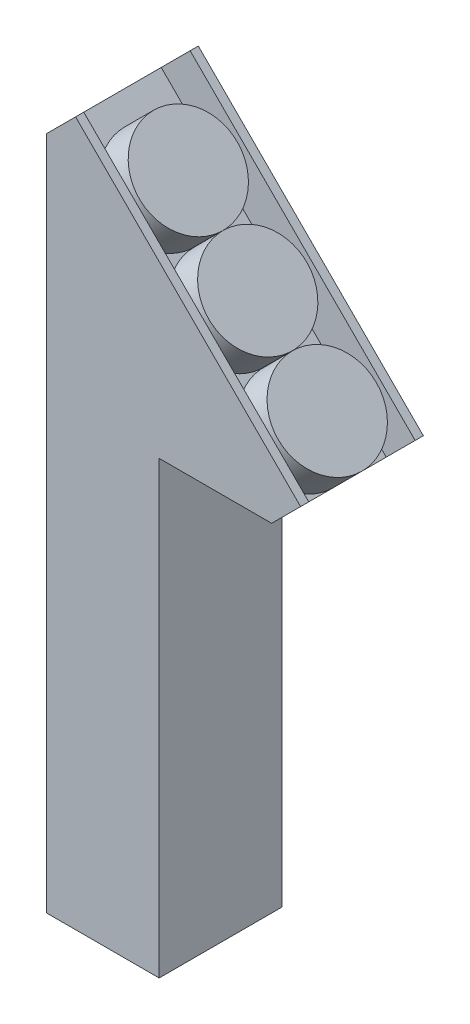
ISO-10303-21;
HEADER;
FILE_DESCRIPTION(('STEP AP214'),'2;1');
FILE_NAME('part.step','',(''),(''),'','','');
FILE_SCHEMA(('AUTOMOTIVE_DESIGN { 1 0 10303 214 1 1 1 1 }'));
ENDSEC;
DATA;
#1=APPLICATION_CONTEXT('core data for automotive mechanical design processes');
#2=APPLICATION_PROTOCOL_DEFINITION('international standard','automotive_design',2000,#1);
#3=PRODUCT_CONTEXT('',#1,'mechanical');
#4=PRODUCT('Part','Part','',(#3));
#5=PRODUCT_RELATED_PRODUCT_CATEGORY('part','',(#4));
#6=PRODUCT_DEFINITION_FORMATION('','',#4);
#7=PRODUCT_DEFINITION_CONTEXT('part definition',#1,'design');
#8=PRODUCT_DEFINITION('design','',#6,#7);
#9=PRODUCT_DEFINITION_SHAPE('','',#8);
#10=(LENGTH_UNIT() NAMED_UNIT(*) SI_UNIT(.MILLI.,.METRE.));
#11=(NAMED_UNIT(*) PLANE_ANGLE_UNIT() SI_UNIT($,.RADIAN.));
#12=(NAMED_UNIT(*) SI_UNIT($,.STERADIAN.) SOLID_ANGLE_UNIT());
#13=UNCERTAINTY_MEASURE_WITH_UNIT(LENGTH_MEASURE(1.E-05),#10,'distance_accuracy_value','');
#14=(GEOMETRIC_REPRESENTATION_CONTEXT(3) GLOBAL_UNCERTAINTY_ASSIGNED_CONTEXT((#13)) GLOBAL_UNIT_ASSIGNED_CONTEXT((#10,
#11,#12)) REPRESENTATION_CONTEXT('',''));
#15=CARTESIAN_POINT('',(0.,0.,0.));
#16=DIRECTION('',(0.,0.,1.));
#17=DIRECTION('',(1.,0.,0.));
#18=AXIS2_PLACEMENT_3D('',#15,#16,#17);
#19=CARTESIAN_POINT('',(0.,55.,-30.));
#20=DIRECTION('',(0.707106781186547,0.707106781186547,0.));
#21=DIRECTION('',(-0.707106781186548,0.707106781186548,0.));
#22=AXIS2_PLACEMENT_3D('',#19,#20,#21);
#23=PLANE('',#22);
#24=CARTESIAN_POINT('',(12.5493848687061,42.4506151312939,-15.));
#25=DIRECTION('',(0.707106781186548,0.707106781186547,0.));
#26=DIRECTION('',(-0.707106781186547,0.707106781186548,0.));
#27=AXIS2_PLACEMENT_3D('',#24,#25,#26);
#28=CIRCLE('',#27,12.);
#29=CARTESIAN_POINT('',(4.06410349446755,50.9358965055325,-15.));
#30=VERTEX_POINT('',#29);
#31=EDGE_CURVE('E390',#30,#30,#28,.T.);
#32=ORIENTED_EDGE('',*,*,#31,.F.);
#33=EDGE_LOOP('',(#32));
#34=FACE_BOUND('',#33,.T.);
#35=CARTESIAN_POINT('',(29.5228789495101,25.4771210504899,-15.));
#36=DIRECTION('',(0.707106781186548,0.707106781186547,0.));
#37=DIRECTION('',(-0.707106781186547,0.707106781186548,0.));
#38=AXIS2_PLACEMENT_3D('',#35,#36,#37);
#39=CIRCLE('',#38,12.);
#40=CARTESIAN_POINT('',(21.0375975752716,33.9624024247284,-15.));
#41=VERTEX_POINT('',#40);
#42=EDGE_CURVE('E389',#41,#41,#39,.T.);
#43=ORIENTED_EDGE('',*,*,#42,.F.);
#44=EDGE_LOOP('',(#43));
#45=FACE_BOUND('',#44,.T.);
#46=DIRECTION('',(0.,0.,1.));
#47=VECTOR('',#46,1.);
#48=CARTESIAN_POINT('',(55.0000000000005,-4.81055590255113E-13,-30.));
#49=LINE('',#48,#47);
#50=CARTESIAN_POINT('',(55.0000000000005,-4.81055590255113E-13,-15.));
#51=VERTEX_POINT('',#50);
#52=CARTESIAN_POINT('',(55.0000000000005,-4.75314232417645E-13,-2.00000000000001));
#53=VERTEX_POINT('',#52);
#54=EDGE_CURVE('E129',#51,#53,#49,.T.);
#55=ORIENTED_EDGE('',*,*,#54,.F.);
#56=CARTESIAN_POINT('',(46.505545828038,8.49445417196198,-15.));
#57=DIRECTION('',(0.707106781186548,0.707106781186547,0.));
#58=DIRECTION('',(-0.707106781186547,0.707106781186548,0.));
#59=AXIS2_PLACEMENT_3D('',#56,#57,#58);
#60=CIRCLE('',#59,12.012972294946);
#61=EDGE_CURVE('E47',#51,#51,#60,.T.);
#62=ORIENTED_EDGE('',*,*,#61,.F.);
#63=CARTESIAN_POINT('',(55.0000000000005,-4.81055590255113E-13,-28.));
#64=VERTEX_POINT('',#63);
#65=EDGE_CURVE('E231',#64,#51,#49,.T.);
#66=ORIENTED_EDGE('',*,*,#65,.F.);
#67=DIRECTION('',(0.707106781186547,-0.707106781186548,0.));
#68=VECTOR('',#67,1.);
#69=CARTESIAN_POINT('',(0.,55.,-28.));
#70=LINE('',#69,#68);
#71=CARTESIAN_POINT('',(0.,55.,-28.));
#72=VERTEX_POINT('',#71);
#73=EDGE_CURVE('E157',#72,#64,#70,.T.);
#74=ORIENTED_EDGE('',*,*,#73,.F.);
#75=DIRECTION('',(0.,0.,1.));
#76=VECTOR('',#75,1.);
#77=CARTESIAN_POINT('',(0.,55.,-30.));
#78=LINE('',#77,#76);
#79=CARTESIAN_POINT('',(0.,55.,-2.));
#80=VERTEX_POINT('',#79);
#81=EDGE_CURVE('E42',#72,#80,#78,.T.);
#82=ORIENTED_EDGE('',*,*,#81,.T.);
#83=DIRECTION('',(-0.707106781186547,0.707106781186548,0.));
#84=VECTOR('',#83,1.);
#85=CARTESIAN_POINT('',(0.,55.,-2.));
#86=LINE('',#85,#84);
#87=EDGE_CURVE('E194',#53,#80,#86,.T.);
#88=ORIENTED_EDGE('',*,*,#87,.F.);
#89=EDGE_LOOP('',(#55,#62,#66,#74,#82,#88));
#90=FACE_BOUND('',#89,.T.);
#91=ADVANCED_FACE('F33',(#34,#45,#90),#23,.T.);
#92=CARTESIAN_POINT('',(55.0000000000005,-4.81055590255113E-13,-30.));
#93=DIRECTION('',(0.,-1.,0.));
#94=DIRECTION('',(1.,0.,0.));
#95=AXIS2_PLACEMENT_3D('',#92,#93,#94);
#96=PLANE('',#95);
#97=DIRECTION('',(0.,0.,1.));
#98=VECTOR('',#97,1.);
#99=CARTESIAN_POINT('',(27.5000000000002,-2.40527795127556E-13,0.));
#100=LINE('',#99,#98);
#101=CARTESIAN_POINT('',(27.5000000000002,-2.40527795127556E-13,-30.));
#102=VERTEX_POINT('',#101);
#103=CARTESIAN_POINT('',(27.5000000000002,-2.40527795127556E-13,0.));
#104=VERTEX_POINT('',#103);
#105=EDGE_CURVE('E54',#102,#104,#100,.T.);
#106=ORIENTED_EDGE('',*,*,#105,.F.);
#107=DIRECTION('',(1.,0.,0.));
#108=VECTOR('',#107,1.);
#109=CARTESIAN_POINT('',(55.0000000000005,-4.81055590255113E-13,-30.));
#110=LINE('',#109,#108);
#111=CARTESIAN_POINT('',(55.0000000000005,-4.81055590255113E-13,-30.));
#112=VERTEX_POINT('',#111);
#113=EDGE_CURVE('E130',#102,#112,#110,.T.);
#114=ORIENTED_EDGE('',*,*,#113,.T.);
#115=EDGE_CURVE('E37',#112,#64,#49,.T.);
#116=ORIENTED_EDGE('',*,*,#115,.T.);
#117=ORIENTED_EDGE('',*,*,#65,.T.);
#118=ORIENTED_EDGE('',*,*,#54,.T.);
#119=DIRECTION('',(0.,0.,-1.));
#120=VECTOR('',#119,1.);
#121=CARTESIAN_POINT('',(55.0000000000005,-4.75314232417645E-13,0.));
#122=LINE('',#121,#120);
#123=CARTESIAN_POINT('',(55.0000000000005,-4.75314232417645E-13,0.));
#124=VERTEX_POINT('',#123);
#125=EDGE_CURVE('E180',#124,#53,#122,.T.);
#126=ORIENTED_EDGE('',*,*,#125,.F.);
#127=DIRECTION('',(1.,0.,0.));
#128=VECTOR('',#127,1.);
#129=CARTESIAN_POINT('',(55.0000000000005,-4.81055590255113E-13,0.));
#130=LINE('',#129,#128);
#131=EDGE_CURVE('E209',#104,#124,#130,.T.);
#132=ORIENTED_EDGE('',*,*,#131,.F.);
#133=EDGE_LOOP('',(#106,#114,#116,#117,#118,#126,#132));
#134=FACE_BOUND('',#133,.T.);
#135=ADVANCED_FACE('F35',(#134),#96,.T.);
#136=CARTESIAN_POINT('',(0.,0.,-30.));
#137=DIRECTION('',(-1.,0.,0.));
#138=DIRECTION('',(0.,0.,1.));
#139=AXIS2_PLACEMENT_3D('',#136,#137,#138);
#140=PLANE('',#139);
#141=DIRECTION('',(0.,-1.,0.));
#142=VECTOR('',#141,1.);
#143=CARTESIAN_POINT('',(0.,0.,0.));
#144=LINE('',#143,#142);
#145=CARTESIAN_POINT('',(0.,55.,0.));
#146=VERTEX_POINT('',#145);
#147=CARTESIAN_POINT('',(-9.62111180510217E-13,-110.,0.));
#148=VERTEX_POINT('',#147);
#149=EDGE_CURVE('E210',#146,#148,#144,.T.);
#150=ORIENTED_EDGE('',*,*,#149,.F.);
#151=DIRECTION('',(0.,0.,1.));
#152=VECTOR('',#151,1.);
#153=CARTESIAN_POINT('',(0.,55.,0.));
#154=LINE('',#153,#152);
#155=EDGE_CURVE('E185',#80,#146,#154,.T.);
#156=ORIENTED_EDGE('',*,*,#155,.F.);
#157=ORIENTED_EDGE('',*,*,#81,.F.);
#158=CARTESIAN_POINT('',(0.,55.,-30.));
#159=VERTEX_POINT('',#158);
#160=EDGE_CURVE('E11',#159,#72,#78,.T.);
#161=ORIENTED_EDGE('',*,*,#160,.F.);
#162=DIRECTION('',(0.,-1.,0.));
#163=VECTOR('',#162,1.);
#164=CARTESIAN_POINT('',(0.,0.,-30.));
#165=LINE('',#164,#163);
#166=CARTESIAN_POINT('',(-9.62111180510217E-13,-110.,-30.));
#167=VERTEX_POINT('',#166);
#168=EDGE_CURVE('E119',#159,#167,#165,.T.);
#169=ORIENTED_EDGE('',*,*,#168,.T.);
#170=DIRECTION('',(0.,0.,-1.));
#171=VECTOR('',#170,1.);
#172=CARTESIAN_POINT('',(-9.62111180510217E-13,-110.,0.));
#173=LINE('',#172,#171);
#174=EDGE_CURVE('E124',#148,#167,#173,.T.);
#175=ORIENTED_EDGE('',*,*,#174,.F.);
#176=EDGE_LOOP('',(#150,#156,#157,#161,#169,#175));
#177=FACE_BOUND('',#176,.T.);
#178=ADVANCED_FACE('F122',(#177),#140,.T.);
#179=CARTESIAN_POINT('',(0.,0.,-30.));
#180=DIRECTION('',(0.,0.,-1.));
#181=DIRECTION('',(-1.,0.,0.));
#182=AXIS2_PLACEMENT_3D('',#179,#180,#181);
#183=PLANE('',#182);
#184=ORIENTED_EDGE('',*,*,#113,.F.);
#185=DIRECTION('',(0.,1.,0.));
#186=VECTOR('',#185,1.);
#187=CARTESIAN_POINT('',(27.4999999999993,-110.,-30.));
#188=LINE('',#187,#186);
#189=CARTESIAN_POINT('',(27.4999999999993,-110.,-30.));
#190=VERTEX_POINT('',#189);
#191=EDGE_CURVE('E136',#190,#102,#188,.T.);
#192=ORIENTED_EDGE('',*,*,#191,.F.);
#193=DIRECTION('',(1.,0.,0.));
#194=VECTOR('',#193,1.);
#195=CARTESIAN_POINT('',(-9.62111180510217E-13,-110.,-30.));
#196=LINE('',#195,#194);
#197=EDGE_CURVE('E133',#167,#190,#196,.T.);
#198=ORIENTED_EDGE('',*,*,#197,.F.);
#199=ORIENTED_EDGE('',*,*,#168,.F.);
#200=DIRECTION('',(-0.707106781186548,-0.707106781186547,0.));
#201=VECTOR('',#200,1.);
#202=CARTESIAN_POINT('',(7.07106781186549,62.0710678118655,-30.));
#203=LINE('',#202,#201);
#204=CARTESIAN_POINT('',(7.07106781186549,62.0710678118655,-30.));
#205=VERTEX_POINT('',#204);
#206=EDGE_CURVE('E178',#205,#159,#203,.T.);
#207=ORIENTED_EDGE('',*,*,#206,.F.);
#208=DIRECTION('',(-0.707106781186547,0.707106781186548,0.));
#209=VECTOR('',#208,1.);
#210=CARTESIAN_POINT('',(7.07106781186549,62.0710678118655,-30.));
#211=LINE('',#210,#209);
#212=CARTESIAN_POINT('',(62.071067811866,7.071067811865,-30.));
#213=VERTEX_POINT('',#212);
#214=EDGE_CURVE('E158',#213,#205,#211,.T.);
#215=ORIENTED_EDGE('',*,*,#214,.F.);
#216=DIRECTION('',(-0.707106781186548,-0.707106781186547,0.));
#217=VECTOR('',#216,1.);
#218=CARTESIAN_POINT('',(62.071067811866,7.071067811865,-30.));
#219=LINE('',#218,#217);
#220=EDGE_CURVE('E167',#213,#112,#219,.T.);
#221=ORIENTED_EDGE('',*,*,#220,.T.);
#222=EDGE_LOOP('',(#184,#192,#198,#199,#207,#215,#221));
#223=FACE_BOUND('',#222,.T.);
#224=ADVANCED_FACE('F134',(#223),#183,.T.);
#225=CARTESIAN_POINT('',(0.,0.,0.));
#226=DIRECTION('',(0.,0.,-1.));
#227=DIRECTION('',(-1.,0.,0.));
#228=AXIS2_PLACEMENT_3D('',#225,#226,#227);
#229=PLANE('',#228);
#230=ORIENTED_EDGE('',*,*,#149,.T.);
#231=DIRECTION('',(-1.,0.,0.));
#232=VECTOR('',#231,1.);
#233=CARTESIAN_POINT('',(-9.62111180510217E-13,-110.,0.));
#234=LINE('',#233,#232);
#235=CARTESIAN_POINT('',(27.4999999999993,-110.,0.));
#236=VERTEX_POINT('',#235);
#237=EDGE_CURVE('E144',#236,#148,#234,.T.);
#238=ORIENTED_EDGE('',*,*,#237,.F.);
#239=DIRECTION('',(0.,1.,0.));
#240=VECTOR('',#239,1.);
#241=CARTESIAN_POINT('',(27.4999999999993,-110.,0.));
#242=LINE('',#241,#240);
#243=EDGE_CURVE('E152',#236,#104,#242,.T.);
#244=ORIENTED_EDGE('',*,*,#243,.T.);
#245=ORIENTED_EDGE('',*,*,#131,.T.);
#246=DIRECTION('',(-0.707106781186548,-0.707106781186547,0.));
#247=VECTOR('',#246,1.);
#248=CARTESIAN_POINT('',(62.071067811866,7.071067811865,0.));
#249=LINE('',#248,#247);
#250=CARTESIAN_POINT('',(62.071067811866,7.071067811865,0.));
#251=VERTEX_POINT('',#250);
#252=EDGE_CURVE('E206',#251,#124,#249,.T.);
#253=ORIENTED_EDGE('',*,*,#252,.F.);
#254=DIRECTION('',(0.707106781186547,-0.707106781186548,0.));
#255=VECTOR('',#254,1.);
#256=CARTESIAN_POINT('',(7.07106781186549,62.0710678118655,0.));
#257=LINE('',#256,#255);
#258=CARTESIAN_POINT('',(7.07106781186549,62.0710678118655,0.));
#259=VERTEX_POINT('',#258);
#260=EDGE_CURVE('E181',#259,#251,#257,.T.);
#261=ORIENTED_EDGE('',*,*,#260,.F.);
#262=DIRECTION('',(-0.707106781186548,-0.707106781186547,0.));
#263=VECTOR('',#262,1.);
#264=CARTESIAN_POINT('',(7.07106781186549,62.0710678118655,0.));
#265=LINE('',#264,#263);
#266=EDGE_CURVE('E191',#259,#146,#265,.T.);
#267=ORIENTED_EDGE('',*,*,#266,.T.);
#268=EDGE_LOOP('',(#230,#238,#244,#245,#253,#261,#267));
#269=FACE_BOUND('',#268,.T.);
#270=ADVANCED_FACE('F214',(#269),#229,.F.);
#271=CARTESIAN_POINT('',(62.071067811866,7.071067811865,0.));
#272=DIRECTION('',(-0.707106781186547,0.707106781186548,0.));
#273=DIRECTION('',(-0.707106781186548,-0.707106781186547,0.));
#274=AXIS2_PLACEMENT_3D('',#271,#272,#273);
#275=PLANE('',#274);
#276=ORIENTED_EDGE('',*,*,#125,.T.);
#277=DIRECTION('',(-0.707106781186548,-0.707106781186547,0.));
#278=VECTOR('',#277,1.);
#279=CARTESIAN_POINT('',(62.071067811866,7.071067811865,-2.00000000000001));
#280=LINE('',#279,#278);
#281=CARTESIAN_POINT('',(62.071067811866,7.071067811865,-2.00000000000001));
#282=VERTEX_POINT('',#281);
#283=EDGE_CURVE('E203',#282,#53,#280,.T.);
#284=ORIENTED_EDGE('',*,*,#283,.F.);
#285=DIRECTION('',(0.,0.,-1.));
#286=VECTOR('',#285,1.);
#287=CARTESIAN_POINT('',(62.071067811866,7.071067811865,0.));
#288=LINE('',#287,#286);
#289=EDGE_CURVE('E184',#251,#282,#288,.T.);
#290=ORIENTED_EDGE('',*,*,#289,.F.);
#291=ORIENTED_EDGE('',*,*,#252,.T.);
#292=EDGE_LOOP('',(#276,#284,#290,#291));
#293=FACE_BOUND('',#292,.T.);
#294=ADVANCED_FACE('F235',(#293),#275,.F.);
#295=CARTESIAN_POINT('',(7.07106781186549,62.0710678118655,-2.));
#296=DIRECTION('',(0.,0.,1.));
#297=DIRECTION('',(0.,-1.,0.));
#298=AXIS2_PLACEMENT_3D('',#295,#296,#297);
#299=PLANE('',#298);
#300=ORIENTED_EDGE('',*,*,#87,.T.);
#301=DIRECTION('',(-0.707106781186548,-0.707106781186547,0.));
#302=VECTOR('',#301,1.);
#303=CARTESIAN_POINT('',(7.07106781186549,62.0710678118655,-2.));
#304=LINE('',#303,#302);
#305=CARTESIAN_POINT('',(7.07106781186549,62.0710678118655,-2.));
#306=VERTEX_POINT('',#305);
#307=EDGE_CURVE('E200',#306,#80,#304,.T.);
#308=ORIENTED_EDGE('',*,*,#307,.F.);
#309=DIRECTION('',(-0.707106781186547,0.707106781186548,0.));
#310=VECTOR('',#309,1.);
#311=CARTESIAN_POINT('',(7.07106781186549,62.0710678118655,-2.));
#312=LINE('',#311,#310);
#313=EDGE_CURVE('E187',#282,#306,#312,.T.);
#314=ORIENTED_EDGE('',*,*,#313,.F.);
#315=ORIENTED_EDGE('',*,*,#283,.T.);
#316=EDGE_LOOP('',(#300,#308,#314,#315));
#317=FACE_BOUND('',#316,.T.);
#318=ADVANCED_FACE('F224',(#317),#299,.F.);
#319=CARTESIAN_POINT('',(7.07106781186549,62.0710678118655,0.));
#320=DIRECTION('',(0.707106781186547,-0.707106781186548,0.));
#321=DIRECTION('',(0.707106781186548,0.707106781186547,0.));
#322=AXIS2_PLACEMENT_3D('',#319,#320,#321);
#323=PLANE('',#322);
#324=ORIENTED_EDGE('',*,*,#155,.T.);
#325=ORIENTED_EDGE('',*,*,#266,.F.);
#326=DIRECTION('',(0.,0.,1.));
#327=VECTOR('',#326,1.);
#328=CARTESIAN_POINT('',(7.07106781186549,62.0710678118655,0.));
#329=LINE('',#328,#327);
#330=EDGE_CURVE('E189',#306,#259,#329,.T.);
#331=ORIENTED_EDGE('',*,*,#330,.F.);
#332=ORIENTED_EDGE('',*,*,#307,.T.);
#333=EDGE_LOOP('',(#324,#325,#331,#332));
#334=FACE_BOUND('',#333,.T.);
#335=ADVANCED_FACE('F219',(#334),#323,.F.);
#336=CARTESIAN_POINT('',(34.5710678118655,34.5710678118655,0.));
#337=DIRECTION('',(0.707106781186548,0.707106781186547,0.));
#338=DIRECTION('',(-0.707106781186547,0.707106781186548,0.));
#339=AXIS2_PLACEMENT_3D('',#336,#337,#338);
#340=PLANE('',#339);
#341=ORIENTED_EDGE('',*,*,#260,.T.);
#342=ORIENTED_EDGE('',*,*,#289,.T.);
#343=ORIENTED_EDGE('',*,*,#313,.T.);
#344=ORIENTED_EDGE('',*,*,#330,.T.);
#345=EDGE_LOOP('',(#341,#342,#343,#344));
#346=FACE_BOUND('',#345,.T.);
#347=ADVANCED_FACE('F273',(#346),#340,.T.);
#348=CARTESIAN_POINT('',(7.07106781186549,62.0710678118655,-30.));
#349=DIRECTION('',(0.707106781186547,-0.707106781186548,0.));
#350=DIRECTION('',(0.707106781186548,0.707106781186547,0.));
#351=AXIS2_PLACEMENT_3D('',#348,#349,#350);
#352=PLANE('',#351);
#353=ORIENTED_EDGE('',*,*,#160,.T.);
#354=DIRECTION('',(-0.707106781186548,-0.707106781186547,0.));
#355=VECTOR('',#354,1.);
#356=CARTESIAN_POINT('',(7.07106781186549,62.0710678118655,-28.));
#357=LINE('',#356,#355);
#358=CARTESIAN_POINT('',(7.07106781186549,62.0710678118655,-28.));
#359=VERTEX_POINT('',#358);
#360=EDGE_CURVE('E175',#359,#72,#357,.T.);
#361=ORIENTED_EDGE('',*,*,#360,.F.);
#362=DIRECTION('',(0.,0.,1.));
#363=VECTOR('',#362,1.);
#364=CARTESIAN_POINT('',(7.07106781186549,62.0710678118655,-30.));
#365=LINE('',#364,#363);
#366=EDGE_CURVE('E161',#205,#359,#365,.T.);
#367=ORIENTED_EDGE('',*,*,#366,.F.);
#368=ORIENTED_EDGE('',*,*,#206,.T.);
#369=EDGE_LOOP('',(#353,#361,#367,#368));
#370=FACE_BOUND('',#369,.T.);
#371=ADVANCED_FACE('F276',(#370),#352,.F.);
#372=CARTESIAN_POINT('',(7.07106781186549,62.0710678118655,-28.));
#373=DIRECTION('',(0.,0.,-1.));
#374=DIRECTION('',(0.,1.,0.));
#375=AXIS2_PLACEMENT_3D('',#372,#373,#374);
#376=PLANE('',#375);
#377=ORIENTED_EDGE('',*,*,#73,.T.);
#378=DIRECTION('',(-0.707106781186548,-0.707106781186547,0.));
#379=VECTOR('',#378,1.);
#380=CARTESIAN_POINT('',(62.071067811866,7.071067811865,-28.));
#381=LINE('',#380,#379);
#382=CARTESIAN_POINT('',(62.071067811866,7.071067811865,-28.));
#383=VERTEX_POINT('',#382);
#384=EDGE_CURVE('E172',#383,#64,#381,.T.);
#385=ORIENTED_EDGE('',*,*,#384,.F.);
#386=DIRECTION('',(0.707106781186547,-0.707106781186548,0.));
#387=VECTOR('',#386,1.);
#388=CARTESIAN_POINT('',(7.07106781186549,62.0710678118655,-28.));
#389=LINE('',#388,#387);
#390=EDGE_CURVE('E163',#359,#383,#389,.T.);
#391=ORIENTED_EDGE('',*,*,#390,.F.);
#392=ORIENTED_EDGE('',*,*,#360,.T.);
#393=EDGE_LOOP('',(#377,#385,#391,#392));
#394=FACE_BOUND('',#393,.T.);
#395=ADVANCED_FACE('F280',(#394),#376,.F.);
#396=CARTESIAN_POINT('',(62.071067811866,7.071067811865,-30.));
#397=DIRECTION('',(-0.707106781186547,0.707106781186548,0.));
#398=DIRECTION('',(-0.707106781186548,-0.707106781186547,0.));
#399=AXIS2_PLACEMENT_3D('',#396,#397,#398);
#400=PLANE('',#399);
#401=ORIENTED_EDGE('',*,*,#115,.F.);
#402=ORIENTED_EDGE('',*,*,#220,.F.);
#403=DIRECTION('',(0.,0.,-1.));
#404=VECTOR('',#403,1.);
#405=CARTESIAN_POINT('',(62.071067811866,7.071067811865,-30.));
#406=LINE('',#405,#404);
#407=EDGE_CURVE('E165',#383,#213,#406,.T.);
#408=ORIENTED_EDGE('',*,*,#407,.F.);
#409=ORIENTED_EDGE('',*,*,#384,.T.);
#410=EDGE_LOOP('',(#401,#402,#408,#409));
#411=FACE_BOUND('',#410,.T.);
#412=ADVANCED_FACE('F250',(#411),#400,.F.);
#413=CARTESIAN_POINT('',(34.5710678118655,34.5710678118655,0.));
#414=DIRECTION('',(-0.707106781186548,-0.707106781186547,0.));
#415=DIRECTION('',(0.707106781186547,-0.707106781186548,0.));
#416=AXIS2_PLACEMENT_3D('',#413,#414,#415);
#417=PLANE('',#416);
#418=ORIENTED_EDGE('',*,*,#214,.T.);
#419=ORIENTED_EDGE('',*,*,#366,.T.);
#420=ORIENTED_EDGE('',*,*,#390,.T.);
#421=ORIENTED_EDGE('',*,*,#407,.T.);
#422=EDGE_LOOP('',(#418,#419,#420,#421));
#423=FACE_BOUND('',#422,.T.);
#424=ADVANCED_FACE('F241',(#423),#417,.F.);
#425=CARTESIAN_POINT('',(27.4999999999993,-110.,0.));
#426=DIRECTION('',(-1.,0.,0.));
#427=DIRECTION('',(0.,-1.,0.));
#428=AXIS2_PLACEMENT_3D('',#425,#426,#427);
#429=PLANE('',#428);
#430=ORIENTED_EDGE('',*,*,#105,.T.);
#431=ORIENTED_EDGE('',*,*,#243,.F.);
#432=DIRECTION('',(0.,0.,1.));
#433=VECTOR('',#432,1.);
#434=CARTESIAN_POINT('',(27.4999999999993,-110.,0.));
#435=LINE('',#434,#433);
#436=EDGE_CURVE('E139',#190,#236,#435,.T.);
#437=ORIENTED_EDGE('',*,*,#436,.F.);
#438=ORIENTED_EDGE('',*,*,#191,.T.);
#439=EDGE_LOOP('',(#430,#431,#437,#438));
#440=FACE_BOUND('',#439,.T.);
#441=ADVANCED_FACE('F239',(#440),#429,.F.);
#442=CARTESIAN_POINT('',(-9.62111180510217E-13,-110.,0.));
#443=DIRECTION('',(0.,-1.,0.));
#444=DIRECTION('',(1.,0.,0.));
#445=AXIS2_PLACEMENT_3D('',#442,#443,#444);
#446=PLANE('',#445);
#447=ORIENTED_EDGE('',*,*,#174,.T.);
#448=ORIENTED_EDGE('',*,*,#197,.T.);
#449=ORIENTED_EDGE('',*,*,#436,.T.);
#450=ORIENTED_EDGE('',*,*,#237,.T.);
#451=EDGE_LOOP('',(#447,#448,#449,#450));
#452=FACE_BOUND('',#451,.T.);
#453=ADVANCED_FACE('F142',(#452),#446,.T.);
#454=CARTESIAN_POINT('',(53.5766136399035,15.5655219838275,-15.));
#455=DIRECTION('',(-0.707106781186548,-0.707106781186547,0.));
#456=DIRECTION('',(0.707106781186547,-0.707106781186548,0.));
#457=AXIS2_PLACEMENT_3D('',#454,#455,#456);
#458=CYLINDRICAL_SURFACE('',#457,12.012972294946);
#459=CARTESIAN_POINT('',(53.5766136399035,15.5655219838275,-15.));
#460=DIRECTION('',(0.707106781186548,0.707106781186547,0.));
#461=DIRECTION('',(-0.707106781186547,0.707106781186548,0.));
#462=AXIS2_PLACEMENT_3D('',#459,#460,#461);
#463=CIRCLE('',#462,12.012972294946);
#464=CARTESIAN_POINT('',(45.0821594679411,24.0599761557899,-15.));
#465=VERTEX_POINT('',#464);
#466=EDGE_CURVE('E146',#465,#465,#463,.T.);
#467=ORIENTED_EDGE('',*,*,#466,.F.);
#468=EDGE_LOOP('',(#467));
#469=FACE_BOUND('',#468,.T.);
#470=ORIENTED_EDGE('',*,*,#61,.T.);
#471=EDGE_LOOP('',(#470));
#472=FACE_BOUND('',#471,.T.);
#473=ADVANCED_FACE('F247',(#469,#472),#458,.T.);
#474=CARTESIAN_POINT('',(53.5766136399035,15.5655219838275,-15.));
#475=DIRECTION('',(0.707106781186548,0.707106781186547,0.));
#476=DIRECTION('',(-0.707106781186547,0.707106781186548,0.));
#477=AXIS2_PLACEMENT_3D('',#474,#475,#476);
#478=PLANE('',#477);
#479=ORIENTED_EDGE('',*,*,#466,.T.);
#480=EDGE_LOOP('',(#479));
#481=FACE_BOUND('',#480,.T.);
#482=ADVANCED_FACE('F332',(#481),#478,.T.);
#483=CARTESIAN_POINT('',(36.5939467613756,32.5481888623553,-15.));
#484=DIRECTION('',(-0.707106781186548,-0.707106781186547,0.));
#485=DIRECTION('',(0.707106781186547,-0.707106781186548,0.));
#486=AXIS2_PLACEMENT_3D('',#483,#484,#485);
#487=CYLINDRICAL_SURFACE('',#486,12.);
#488=CARTESIAN_POINT('',(36.5939467613756,32.5481888623553,-15.));
#489=DIRECTION('',(0.707106781186548,0.707106781186547,0.));
#490=DIRECTION('',(-0.707106781186547,0.707106781186548,0.));
#491=AXIS2_PLACEMENT_3D('',#488,#489,#490);
#492=CIRCLE('',#491,12.);
#493=CARTESIAN_POINT('',(28.108665387137,41.0334702365939,-15.));
#494=VERTEX_POINT('',#493);
#495=EDGE_CURVE('E393',#494,#494,#492,.T.);
#496=ORIENTED_EDGE('',*,*,#495,.F.);
#497=EDGE_LOOP('',(#496));
#498=FACE_BOUND('',#497,.T.);
#499=ORIENTED_EDGE('',*,*,#42,.T.);
#500=EDGE_LOOP('',(#499));
#501=FACE_BOUND('',#500,.T.);
#502=ADVANCED_FACE('F339',(#498,#501),#487,.T.);
#503=CARTESIAN_POINT('',(36.5939467613756,32.5481888623553,-15.));
#504=DIRECTION('',(0.707106781186548,0.707106781186547,0.));
#505=DIRECTION('',(-0.707106781186547,0.707106781186548,0.));
#506=AXIS2_PLACEMENT_3D('',#503,#504,#505);
#507=PLANE('',#506);
#508=ORIENTED_EDGE('',*,*,#495,.T.);
#509=EDGE_LOOP('',(#508));
#510=FACE_BOUND('',#509,.T.);
#511=ADVANCED_FACE('F347',(#510),#507,.T.);
#512=CARTESIAN_POINT('',(19.6204526805716,49.5216829431594,-15.));
#513=DIRECTION('',(-0.707106781186548,-0.707106781186547,0.));
#514=DIRECTION('',(0.707106781186547,-0.707106781186548,0.));
#515=AXIS2_PLACEMENT_3D('',#512,#513,#514);
#516=CYLINDRICAL_SURFACE('',#515,12.);
#517=CARTESIAN_POINT('',(19.6204526805716,49.5216829431594,-15.));
#518=DIRECTION('',(0.707106781186548,0.707106781186547,0.));
#519=DIRECTION('',(-0.707106781186547,0.707106781186548,0.));
#520=AXIS2_PLACEMENT_3D('',#517,#518,#519);
#521=CIRCLE('',#520,12.);
#522=CARTESIAN_POINT('',(11.135171306333,58.006964317398,-15.));
#523=VERTEX_POINT('',#522);
#524=EDGE_CURVE('E388',#523,#523,#521,.T.);
#525=ORIENTED_EDGE('',*,*,#524,.F.);
#526=EDGE_LOOP('',(#525));
#527=FACE_BOUND('',#526,.T.);
#528=ORIENTED_EDGE('',*,*,#31,.T.);
#529=EDGE_LOOP('',(#528));
#530=FACE_BOUND('',#529,.T.);
#531=ADVANCED_FACE('F355',(#527,#530),#516,.T.);
#532=CARTESIAN_POINT('',(19.6204526805716,49.5216829431594,-15.));
#533=DIRECTION('',(0.707106781186548,0.707106781186547,0.));
#534=DIRECTION('',(-0.707106781186547,0.707106781186548,0.));
#535=AXIS2_PLACEMENT_3D('',#532,#533,#534);
#536=PLANE('',#535);
#537=ORIENTED_EDGE('',*,*,#524,.T.);
#538=EDGE_LOOP('',(#537));
#539=FACE_BOUND('',#538,.T.);
#540=ADVANCED_FACE('F363',(#539),#536,.T.);
#541=CLOSED_SHELL('',(#91,#135,#178,#224,#270,#294,#318,#335,#347,#371,#395,#412,#424,#441,#453,
#473,#482,#502,#511,#531,#540));
#542=MANIFOLD_SOLID_BREP('B2',#541);
#543=ADVANCED_BREP_SHAPE_REPRESENTATION('',(#18,#542),#14);
#544=SHAPE_DEFINITION_REPRESENTATION(#9,#543);
ENDSEC;
END-ISO-10303-21;
